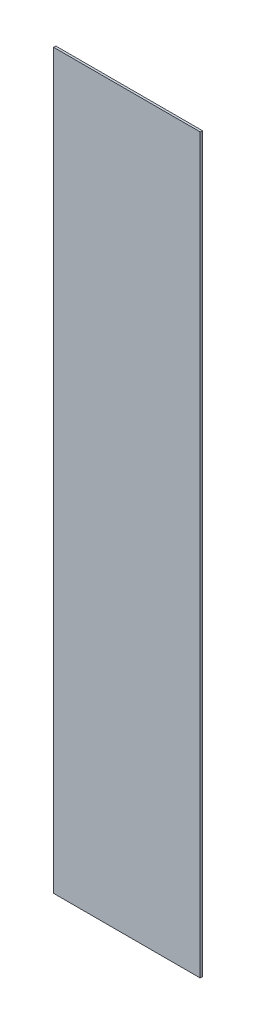
ISO-10303-21;
HEADER;
FILE_DESCRIPTION(('STEP AP214'),'2;1');
FILE_NAME('part.step','',(''),(''),'','','');
FILE_SCHEMA(('AUTOMOTIVE_DESIGN { 1 0 10303 214 1 1 1 1 }'));
ENDSEC;
DATA;
#1=APPLICATION_CONTEXT('core data for automotive mechanical design processes');
#2=APPLICATION_PROTOCOL_DEFINITION('international standard','automotive_design',2000,#1);
#3=PRODUCT_CONTEXT('',#1,'mechanical');
#4=PRODUCT('Part','Part','',(#3));
#5=PRODUCT_RELATED_PRODUCT_CATEGORY('part','',(#4));
#6=PRODUCT_DEFINITION_FORMATION('','',#4);
#7=PRODUCT_DEFINITION_CONTEXT('part definition',#1,'design');
#8=PRODUCT_DEFINITION('design','',#6,#7);
#9=PRODUCT_DEFINITION_SHAPE('','',#8);
#10=(LENGTH_UNIT() NAMED_UNIT(*) SI_UNIT(.MILLI.,.METRE.));
#11=(NAMED_UNIT(*) PLANE_ANGLE_UNIT() SI_UNIT($,.RADIAN.));
#12=(NAMED_UNIT(*) SI_UNIT($,.STERADIAN.) SOLID_ANGLE_UNIT());
#13=UNCERTAINTY_MEASURE_WITH_UNIT(LENGTH_MEASURE(1.E-05),#10,'distance_accuracy_value','');
#14=(GEOMETRIC_REPRESENTATION_CONTEXT(3) GLOBAL_UNCERTAINTY_ASSIGNED_CONTEXT((#13)) GLOBAL_UNIT_ASSIGNED_CONTEXT((#10,
#11,#12)) REPRESENTATION_CONTEXT('',''));
#15=CARTESIAN_POINT('',(0.,0.,0.));
#16=DIRECTION('',(0.,0.,1.));
#17=DIRECTION('',(1.,0.,0.));
#18=AXIS2_PLACEMENT_3D('',#15,#16,#17);
#19=CARTESIAN_POINT('',(12.6999999999999,63.5,-0.1905));
#20=DIRECTION('',(-1.,0.,0.));
#21=DIRECTION('',(0.,0.,1.));
#22=AXIS2_PLACEMENT_3D('',#19,#20,#21);
#23=PLANE('',#22);
#24=DIRECTION('',(0.,0.,-1.));
#25=VECTOR('',#24,1.);
#26=CARTESIAN_POINT('',(12.6999999999999,-63.5,-0.1905));
#27=LINE('',#26,#25);
#28=CARTESIAN_POINT('',(12.6999999999999,-63.5,0.1905));
#29=VERTEX_POINT('',#28);
#30=CARTESIAN_POINT('',(12.6999999999999,-63.5,-0.1905));
#31=VERTEX_POINT('',#30);
#32=EDGE_CURVE('E107',#29,#31,#27,.T.);
#33=ORIENTED_EDGE('',*,*,#32,.T.);
#34=DIRECTION('',(0.,-1.,0.));
#35=VECTOR('',#34,1.);
#36=CARTESIAN_POINT('',(12.6999999999999,63.5,-0.1905));
#37=LINE('',#36,#35);
#38=CARTESIAN_POINT('',(12.6999999999999,63.5,-0.1905));
#39=VERTEX_POINT('',#38);
#40=EDGE_CURVE('E11',#39,#31,#37,.T.);
#41=ORIENTED_EDGE('',*,*,#40,.F.);
#42=DIRECTION('',(0.,0.,-1.));
#43=VECTOR('',#42,1.);
#44=CARTESIAN_POINT('',(12.6999999999999,63.5,-0.1905));
#45=LINE('',#44,#43);
#46=CARTESIAN_POINT('',(12.6999999999999,63.5,0.1905));
#47=VERTEX_POINT('',#46);
#48=EDGE_CURVE('E91',#47,#39,#45,.T.);
#49=ORIENTED_EDGE('',*,*,#48,.F.);
#50=DIRECTION('',(0.,-1.,0.));
#51=VECTOR('',#50,1.);
#52=CARTESIAN_POINT('',(12.6999999999999,63.5,0.1905));
#53=LINE('',#52,#51);
#54=EDGE_CURVE('E103',#47,#29,#53,.T.);
#55=ORIENTED_EDGE('',*,*,#54,.T.);
#56=EDGE_LOOP('',(#33,#41,#49,#55));
#57=FACE_BOUND('',#56,.T.);
#58=ADVANCED_FACE('F39',(#57),#23,.F.);
#59=CARTESIAN_POINT('',(-12.7000000000001,63.5,-0.1905));
#60=DIRECTION('',(0.,0.,1.));
#61=DIRECTION('',(1.,0.,0.));
#62=AXIS2_PLACEMENT_3D('',#59,#60,#61);
#63=PLANE('',#62);
#64=DIRECTION('',(-1.,0.,0.));
#65=VECTOR('',#64,1.);
#66=CARTESIAN_POINT('',(-12.7000000000001,-63.5,-0.1905));
#67=LINE('',#66,#65);
#68=CARTESIAN_POINT('',(-12.7000000000001,-63.5,-0.1905));
#69=VERTEX_POINT('',#68);
#70=EDGE_CURVE('E96',#31,#69,#67,.T.);
#71=ORIENTED_EDGE('',*,*,#70,.T.);
#72=DIRECTION('',(0.,-1.,0.));
#73=VECTOR('',#72,1.);
#74=CARTESIAN_POINT('',(-12.7000000000001,63.5,-0.1905));
#75=LINE('',#74,#73);
#76=CARTESIAN_POINT('',(-12.7000000000001,63.5,-0.1905));
#77=VERTEX_POINT('',#76);
#78=EDGE_CURVE('E48',#77,#69,#75,.T.);
#79=ORIENTED_EDGE('',*,*,#78,.F.);
#80=DIRECTION('',(-1.,0.,0.));
#81=VECTOR('',#80,1.);
#82=CARTESIAN_POINT('',(-12.7000000000001,63.5,-0.1905));
#83=LINE('',#82,#81);
#84=EDGE_CURVE('E86',#39,#77,#83,.T.);
#85=ORIENTED_EDGE('',*,*,#84,.F.);
#86=ORIENTED_EDGE('',*,*,#40,.T.);
#87=EDGE_LOOP('',(#71,#79,#85,#86));
#88=FACE_BOUND('',#87,.T.);
#89=ADVANCED_FACE('F95',(#88),#63,.F.);
#90=CARTESIAN_POINT('',(-12.7000000000001,63.5,-0.1905));
#91=DIRECTION('',(1.,0.,0.));
#92=DIRECTION('',(0.,0.,-1.));
#93=AXIS2_PLACEMENT_3D('',#90,#91,#92);
#94=PLANE('',#93);
#95=DIRECTION('',(0.,0.,1.));
#96=VECTOR('',#95,1.);
#97=CARTESIAN_POINT('',(-12.7000000000001,-63.5,-0.1905));
#98=LINE('',#97,#96);
#99=CARTESIAN_POINT('',(-12.7000000000001,-63.5,0.1905));
#100=VERTEX_POINT('',#99);
#101=EDGE_CURVE('E73',#69,#100,#98,.T.);
#102=ORIENTED_EDGE('',*,*,#101,.T.);
#103=DIRECTION('',(0.,-1.,0.));
#104=VECTOR('',#103,1.);
#105=CARTESIAN_POINT('',(-12.7000000000001,63.5,0.1905));
#106=LINE('',#105,#104);
#107=CARTESIAN_POINT('',(-12.7000000000001,63.5,0.1905));
#108=VERTEX_POINT('',#107);
#109=EDGE_CURVE('E98',#108,#100,#106,.T.);
#110=ORIENTED_EDGE('',*,*,#109,.F.);
#111=DIRECTION('',(0.,0.,1.));
#112=VECTOR('',#111,1.);
#113=CARTESIAN_POINT('',(-12.7000000000001,63.5,-0.1905));
#114=LINE('',#113,#112);
#115=EDGE_CURVE('E89',#77,#108,#114,.T.);
#116=ORIENTED_EDGE('',*,*,#115,.F.);
#117=ORIENTED_EDGE('',*,*,#78,.T.);
#118=EDGE_LOOP('',(#102,#110,#116,#117));
#119=FACE_BOUND('',#118,.T.);
#120=ADVANCED_FACE('F99',(#119),#94,.F.);
#121=CARTESIAN_POINT('',(-12.7000000000001,63.5,0.1905));
#122=DIRECTION('',(0.,0.,-1.));
#123=DIRECTION('',(-1.,0.,0.));
#124=AXIS2_PLACEMENT_3D('',#121,#122,#123);
#125=PLANE('',#124);
#126=DIRECTION('',(1.,0.,0.));
#127=VECTOR('',#126,1.);
#128=CARTESIAN_POINT('',(-12.7000000000001,-63.5,0.1905));
#129=LINE('',#128,#127);
#130=EDGE_CURVE('E79',#100,#29,#129,.T.);
#131=ORIENTED_EDGE('',*,*,#130,.T.);
#132=ORIENTED_EDGE('',*,*,#54,.F.);
#133=DIRECTION('',(1.,0.,0.));
#134=VECTOR('',#133,1.);
#135=CARTESIAN_POINT('',(-12.7000000000001,63.5,0.1905));
#136=LINE('',#135,#134);
#137=EDGE_CURVE('E56',#108,#47,#136,.T.);
#138=ORIENTED_EDGE('',*,*,#137,.F.);
#139=ORIENTED_EDGE('',*,*,#109,.T.);
#140=EDGE_LOOP('',(#131,#132,#138,#139));
#141=FACE_BOUND('',#140,.T.);
#142=ADVANCED_FACE('F120',(#141),#125,.F.);
#143=CARTESIAN_POINT('',(0.,63.5,0.));
#144=DIRECTION('',(0.,1.,0.));
#145=DIRECTION('',(0.,0.,1.));
#146=AXIS2_PLACEMENT_3D('',#143,#144,#145);
#147=PLANE('',#146);
#148=ORIENTED_EDGE('',*,*,#48,.T.);
#149=ORIENTED_EDGE('',*,*,#84,.T.);
#150=ORIENTED_EDGE('',*,*,#115,.T.);
#151=ORIENTED_EDGE('',*,*,#137,.T.);
#152=EDGE_LOOP('',(#148,#149,#150,#151));
#153=FACE_BOUND('',#152,.T.);
#154=ADVANCED_FACE('F87',(#153),#147,.T.);
#155=CARTESIAN_POINT('',(0.,-63.5,0.));
#156=DIRECTION('',(0.,1.,0.));
#157=DIRECTION('',(0.,0.,1.));
#158=AXIS2_PLACEMENT_3D('',#155,#156,#157);
#159=PLANE('',#158);
#160=ORIENTED_EDGE('',*,*,#32,.F.);
#161=ORIENTED_EDGE('',*,*,#130,.F.);
#162=ORIENTED_EDGE('',*,*,#101,.F.);
#163=ORIENTED_EDGE('',*,*,#70,.F.);
#164=EDGE_LOOP('',(#160,#161,#162,#163));
#165=FACE_BOUND('',#164,.T.);
#166=ADVANCED_FACE('F123',(#165),#159,.F.);
#167=CLOSED_SHELL('',(#58,#89,#120,#142,#154,#166));
#168=MANIFOLD_SOLID_BREP('B2',#167);
#169=ADVANCED_BREP_SHAPE_REPRESENTATION('',(#18,#168),#14);
#170=SHAPE_DEFINITION_REPRESENTATION(#9,#169);
ENDSEC;
END-ISO-10303-21;
